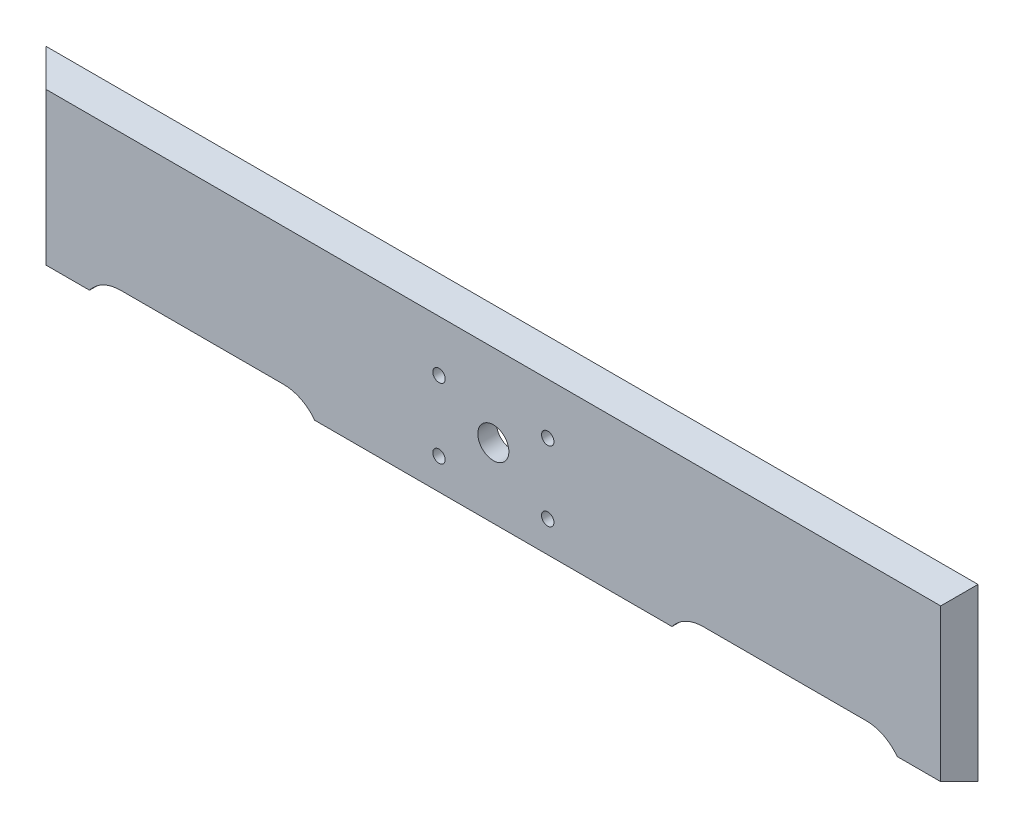
ISO-10303-21;
HEADER;
FILE_DESCRIPTION(('STEP AP214'),'2;1');
FILE_NAME('part.step','',(''),(''),'','','');
FILE_SCHEMA(('AUTOMOTIVE_DESIGN { 1 0 10303 214 1 1 1 1 }'));
ENDSEC;
DATA;
#1=APPLICATION_CONTEXT('core data for automotive mechanical design processes');
#2=APPLICATION_PROTOCOL_DEFINITION('international standard','automotive_design',2000,#1);
#3=PRODUCT_CONTEXT('',#1,'mechanical');
#4=PRODUCT('Part','Part','',(#3));
#5=PRODUCT_RELATED_PRODUCT_CATEGORY('part','',(#4));
#6=PRODUCT_DEFINITION_FORMATION('','',#4);
#7=PRODUCT_DEFINITION_CONTEXT('part definition',#1,'design');
#8=PRODUCT_DEFINITION('design','',#6,#7);
#9=PRODUCT_DEFINITION_SHAPE('','',#8);
#10=(LENGTH_UNIT() NAMED_UNIT(*) SI_UNIT(.MILLI.,.METRE.));
#11=(NAMED_UNIT(*) PLANE_ANGLE_UNIT() SI_UNIT($,.RADIAN.));
#12=(NAMED_UNIT(*) SI_UNIT($,.STERADIAN.) SOLID_ANGLE_UNIT());
#13=UNCERTAINTY_MEASURE_WITH_UNIT(LENGTH_MEASURE(1.E-05),#10,'distance_accuracy_value','');
#14=(GEOMETRIC_REPRESENTATION_CONTEXT(3) GLOBAL_UNCERTAINTY_ASSIGNED_CONTEXT((#13)) GLOBAL_UNIT_ASSIGNED_CONTEXT((#10,
#11,#12)) REPRESENTATION_CONTEXT('',''));
#15=CARTESIAN_POINT('',(0.,0.,0.));
#16=DIRECTION('',(0.,0.,1.));
#17=DIRECTION('',(1.,0.,0.));
#18=AXIS2_PLACEMENT_3D('',#15,#16,#17);
#19=CARTESIAN_POINT('',(0.,-10.,12.));
#20=DIRECTION('',(0.,1.,0.));
#21=DIRECTION('',(-1.,0.,0.));
#22=AXIS2_PLACEMENT_3D('',#19,#20,#21);
#23=PLANE('',#22);
#24=DIRECTION('',(1.,0.,0.));
#25=VECTOR('',#24,1.);
#26=CARTESIAN_POINT('',(0.,-10.,12.));
#27=LINE('',#26,#25);
#28=CARTESIAN_POINT('',(12.,-10.,12.));
#29=VERTEX_POINT('',#28);
#30=CARTESIAN_POINT('',(40.,-10.,12.));
#31=VERTEX_POINT('',#30);
#32=EDGE_CURVE('E133',#29,#31,#27,.T.);
#33=ORIENTED_EDGE('',*,*,#32,.F.);
#34=DIRECTION('',(-0.707106781186547,0.,-0.707106781186548));
#35=VECTOR('',#34,1.);
#36=CARTESIAN_POINT('',(12.,-10.,12.));
#37=LINE('',#36,#35);
#38=CARTESIAN_POINT('',(0.,-10.,0.));
#39=VERTEX_POINT('',#38);
#40=EDGE_CURVE('E11',#29,#39,#37,.T.);
#41=ORIENTED_EDGE('',*,*,#40,.T.);
#42=DIRECTION('',(1.,0.,0.));
#43=VECTOR('',#42,1.);
#44=CARTESIAN_POINT('',(0.,-10.,0.));
#45=LINE('',#44,#43);
#46=CARTESIAN_POINT('',(40.,-10.,0.));
#47=VERTEX_POINT('',#46);
#48=EDGE_CURVE('E149',#39,#47,#45,.T.);
#49=ORIENTED_EDGE('',*,*,#48,.T.);
#50=DIRECTION('',(0.,0.,-1.));
#51=VECTOR('',#50,1.);
#52=CARTESIAN_POINT('',(40.,-10.,12.));
#53=LINE('',#52,#51);
#54=EDGE_CURVE('E147',#31,#47,#53,.T.);
#55=ORIENTED_EDGE('',*,*,#54,.F.);
#56=EDGE_LOOP('',(#33,#41,#49,#55));
#57=FACE_BOUND('',#56,.T.);
#58=ADVANCED_FACE('F41',(#57),#23,.F.);
#59=CARTESIAN_POINT('',(60.,-25.,12.));
#60=DIRECTION('',(0.,0.,-1.));
#61=DIRECTION('',(-1.,0.,0.));
#62=AXIS2_PLACEMENT_3D('',#59,#60,#61);
#63=CYLINDRICAL_SURFACE('',#62,25.);
#64=CARTESIAN_POINT('',(60.,-25.,0.));
#65=DIRECTION('',(0.,0.,-1.));
#66=DIRECTION('',(-1.,0.,0.));
#67=AXIS2_PLACEMENT_3D('',#64,#65,#66);
#68=CIRCLE('',#67,25.);
#69=CARTESIAN_POINT('',(60.,0.,0.));
#70=VERTEX_POINT('',#69);
#71=EDGE_CURVE('E190',#47,#70,#68,.T.);
#72=ORIENTED_EDGE('',*,*,#71,.T.);
#73=DIRECTION('',(0.,0.,-1.));
#74=VECTOR('',#73,1.);
#75=CARTESIAN_POINT('',(60.,0.,12.));
#76=LINE('',#75,#74);
#77=CARTESIAN_POINT('',(60.,0.,12.));
#78=VERTEX_POINT('',#77);
#79=EDGE_CURVE('E153',#78,#70,#76,.T.);
#80=ORIENTED_EDGE('',*,*,#79,.F.);
#81=CARTESIAN_POINT('',(60.,-25.,12.));
#82=DIRECTION('',(0.,0.,-1.));
#83=DIRECTION('',(-1.,0.,0.));
#84=AXIS2_PLACEMENT_3D('',#81,#82,#83);
#85=CIRCLE('',#84,25.);
#86=EDGE_CURVE('E138',#31,#78,#85,.T.);
#87=ORIENTED_EDGE('',*,*,#86,.F.);
#88=ORIENTED_EDGE('',*,*,#54,.T.);
#89=EDGE_LOOP('',(#72,#80,#87,#88));
#90=FACE_BOUND('',#89,.T.);
#91=ADVANCED_FACE('F155',(#90),#63,.F.);
#92=CARTESIAN_POINT('',(60.,0.,12.));
#93=DIRECTION('',(0.,1.,0.));
#94=DIRECTION('',(0.,0.,1.));
#95=AXIS2_PLACEMENT_3D('',#92,#93,#94);
#96=PLANE('',#95);
#97=DIRECTION('',(1.,0.,0.));
#98=VECTOR('',#97,1.);
#99=CARTESIAN_POINT('',(60.,0.,0.));
#100=LINE('',#99,#98);
#101=CARTESIAN_POINT('',(165.,0.,0.));
#102=VERTEX_POINT('',#101);
#103=EDGE_CURVE('E193',#70,#102,#100,.T.);
#104=ORIENTED_EDGE('',*,*,#103,.T.);
#105=DIRECTION('',(0.,0.,-1.));
#106=VECTOR('',#105,1.);
#107=CARTESIAN_POINT('',(165.,0.,12.));
#108=LINE('',#107,#106);
#109=CARTESIAN_POINT('',(165.,0.,12.));
#110=VERTEX_POINT('',#109);
#111=EDGE_CURVE('E240',#110,#102,#108,.T.);
#112=ORIENTED_EDGE('',*,*,#111,.F.);
#113=DIRECTION('',(1.,0.,0.));
#114=VECTOR('',#113,1.);
#115=CARTESIAN_POINT('',(60.,0.,12.));
#116=LINE('',#115,#114);
#117=EDGE_CURVE('E159',#78,#110,#116,.T.);
#118=ORIENTED_EDGE('',*,*,#117,.F.);
#119=ORIENTED_EDGE('',*,*,#79,.T.);
#120=EDGE_LOOP('',(#104,#112,#118,#119));
#121=FACE_BOUND('',#120,.T.);
#122=ADVANCED_FACE('F347',(#121),#96,.F.);
#123=CARTESIAN_POINT('',(165.,-25.,12.));
#124=DIRECTION('',(0.,0.,-1.));
#125=DIRECTION('',(-1.,0.,0.));
#126=AXIS2_PLACEMENT_3D('',#123,#124,#125);
#127=CYLINDRICAL_SURFACE('',#126,25.);
#128=CARTESIAN_POINT('',(165.,-25.,0.));
#129=DIRECTION('',(0.,0.,-1.));
#130=DIRECTION('',(1.,0.,0.));
#131=AXIS2_PLACEMENT_3D('',#128,#129,#130);
#132=CIRCLE('',#131,25.);
#133=CARTESIAN_POINT('',(185.,-10.0000000000001,0.));
#134=VERTEX_POINT('',#133);
#135=EDGE_CURVE('E196',#102,#134,#132,.T.);
#136=ORIENTED_EDGE('',*,*,#135,.T.);
#137=DIRECTION('',(0.,0.,-1.));
#138=VECTOR('',#137,1.);
#139=CARTESIAN_POINT('',(185.,-10.0000000000001,12.));
#140=LINE('',#139,#138);
#141=CARTESIAN_POINT('',(185.,-10.0000000000001,12.));
#142=VERTEX_POINT('',#141);
#143=EDGE_CURVE('E236',#142,#134,#140,.T.);
#144=ORIENTED_EDGE('',*,*,#143,.F.);
#145=CARTESIAN_POINT('',(165.,-25.,12.));
#146=DIRECTION('',(0.,0.,-1.));
#147=DIRECTION('',(1.,0.,0.));
#148=AXIS2_PLACEMENT_3D('',#145,#146,#147);
#149=CIRCLE('',#148,25.);
#150=EDGE_CURVE('E162',#110,#142,#149,.T.);
#151=ORIENTED_EDGE('',*,*,#150,.F.);
#152=ORIENTED_EDGE('',*,*,#111,.T.);
#153=EDGE_LOOP('',(#136,#144,#151,#152));
#154=FACE_BOUND('',#153,.T.);
#155=ADVANCED_FACE('F344',(#154),#127,.F.);
#156=CARTESIAN_POINT('',(185.,-10.,12.));
#157=DIRECTION('',(0.,1.,0.));
#158=DIRECTION('',(0.,0.,1.));
#159=AXIS2_PLACEMENT_3D('',#156,#157,#158);
#160=PLANE('',#159);
#161=DIRECTION('',(1.,0.,0.));
#162=VECTOR('',#161,1.);
#163=CARTESIAN_POINT('',(185.,-10.,0.));
#164=LINE('',#163,#162);
#165=CARTESIAN_POINT('',(415.,-10.,0.));
#166=VERTEX_POINT('',#165);
#167=EDGE_CURVE('E199',#134,#166,#164,.T.);
#168=ORIENTED_EDGE('',*,*,#167,.T.);
#169=DIRECTION('',(0.,0.,-1.));
#170=VECTOR('',#169,1.);
#171=CARTESIAN_POINT('',(415.,-10.,12.));
#172=LINE('',#171,#170);
#173=CARTESIAN_POINT('',(415.,-10.,12.));
#174=VERTEX_POINT('',#173);
#175=EDGE_CURVE('E232',#174,#166,#172,.T.);
#176=ORIENTED_EDGE('',*,*,#175,.F.);
#177=DIRECTION('',(1.,0.,0.));
#178=VECTOR('',#177,1.);
#179=CARTESIAN_POINT('',(185.,-10.,12.));
#180=LINE('',#179,#178);
#181=EDGE_CURVE('E168',#142,#174,#180,.T.);
#182=ORIENTED_EDGE('',*,*,#181,.F.);
#183=ORIENTED_EDGE('',*,*,#143,.T.);
#184=EDGE_LOOP('',(#168,#176,#182,#183));
#185=FACE_BOUND('',#184,.T.);
#186=ADVANCED_FACE('F339',(#185),#160,.F.);
#187=CARTESIAN_POINT('',(435.,-25.,12.));
#188=DIRECTION('',(0.,0.,-1.));
#189=DIRECTION('',(-1.,0.,0.));
#190=AXIS2_PLACEMENT_3D('',#187,#188,#189);
#191=CYLINDRICAL_SURFACE('',#190,25.);
#192=CARTESIAN_POINT('',(435.,-25.,0.));
#193=DIRECTION('',(0.,0.,-1.));
#194=DIRECTION('',(-1.,0.,0.));
#195=AXIS2_PLACEMENT_3D('',#192,#193,#194);
#196=CIRCLE('',#195,25.);
#197=CARTESIAN_POINT('',(435.,0.,0.));
#198=VERTEX_POINT('',#197);
#199=EDGE_CURVE('E202',#166,#198,#196,.T.);
#200=ORIENTED_EDGE('',*,*,#199,.T.);
#201=DIRECTION('',(0.,0.,-1.));
#202=VECTOR('',#201,1.);
#203=CARTESIAN_POINT('',(435.,0.,12.));
#204=LINE('',#203,#202);
#205=CARTESIAN_POINT('',(435.,0.,12.));
#206=VERTEX_POINT('',#205);
#207=EDGE_CURVE('E228',#206,#198,#204,.T.);
#208=ORIENTED_EDGE('',*,*,#207,.F.);
#209=CARTESIAN_POINT('',(435.,-25.,12.));
#210=DIRECTION('',(0.,0.,-1.));
#211=DIRECTION('',(-1.,0.,0.));
#212=AXIS2_PLACEMENT_3D('',#209,#210,#211);
#213=CIRCLE('',#212,25.);
#214=EDGE_CURVE('E171',#174,#206,#213,.T.);
#215=ORIENTED_EDGE('',*,*,#214,.F.);
#216=ORIENTED_EDGE('',*,*,#175,.T.);
#217=EDGE_LOOP('',(#200,#208,#215,#216));
#218=FACE_BOUND('',#217,.T.);
#219=ADVANCED_FACE('F333',(#218),#191,.F.);
#220=CARTESIAN_POINT('',(435.,0.,12.));
#221=DIRECTION('',(0.,1.,0.));
#222=DIRECTION('',(0.,0.,1.));
#223=AXIS2_PLACEMENT_3D('',#220,#221,#222);
#224=PLANE('',#223);
#225=DIRECTION('',(1.,0.,0.));
#226=VECTOR('',#225,1.);
#227=CARTESIAN_POINT('',(435.,0.,0.));
#228=LINE('',#227,#226);
#229=CARTESIAN_POINT('',(540.,0.,0.));
#230=VERTEX_POINT('',#229);
#231=EDGE_CURVE('E205',#198,#230,#228,.T.);
#232=ORIENTED_EDGE('',*,*,#231,.T.);
#233=DIRECTION('',(0.,0.,-1.));
#234=VECTOR('',#233,1.);
#235=CARTESIAN_POINT('',(540.,0.,12.));
#236=LINE('',#235,#234);
#237=CARTESIAN_POINT('',(540.,0.,12.));
#238=VERTEX_POINT('',#237);
#239=EDGE_CURVE('E224',#238,#230,#236,.T.);
#240=ORIENTED_EDGE('',*,*,#239,.F.);
#241=DIRECTION('',(1.,0.,0.));
#242=VECTOR('',#241,1.);
#243=CARTESIAN_POINT('',(435.,0.,12.));
#244=LINE('',#243,#242);
#245=EDGE_CURVE('E174',#206,#238,#244,.T.);
#246=ORIENTED_EDGE('',*,*,#245,.F.);
#247=ORIENTED_EDGE('',*,*,#207,.T.);
#248=EDGE_LOOP('',(#232,#240,#246,#247));
#249=FACE_BOUND('',#248,.T.);
#250=ADVANCED_FACE('F329',(#249),#224,.F.);
#251=CARTESIAN_POINT('',(540.,-25.,12.));
#252=DIRECTION('',(0.,0.,-1.));
#253=DIRECTION('',(-1.,0.,0.));
#254=AXIS2_PLACEMENT_3D('',#251,#252,#253);
#255=CYLINDRICAL_SURFACE('',#254,25.);
#256=CARTESIAN_POINT('',(540.,-25.,0.));
#257=DIRECTION('',(0.,0.,-1.));
#258=DIRECTION('',(1.,0.,0.));
#259=AXIS2_PLACEMENT_3D('',#256,#257,#258);
#260=CIRCLE('',#259,25.);
#261=CARTESIAN_POINT('',(560.,-10.,0.));
#262=VERTEX_POINT('',#261);
#263=EDGE_CURVE('E208',#230,#262,#260,.T.);
#264=ORIENTED_EDGE('',*,*,#263,.T.);
#265=DIRECTION('',(0.,0.,-1.));
#266=VECTOR('',#265,1.);
#267=CARTESIAN_POINT('',(560.,-10.,12.));
#268=LINE('',#267,#266);
#269=CARTESIAN_POINT('',(560.,-10.,12.));
#270=VERTEX_POINT('',#269);
#271=EDGE_CURVE('E183',#270,#262,#268,.T.);
#272=ORIENTED_EDGE('',*,*,#271,.F.);
#273=CARTESIAN_POINT('',(540.,-25.,12.));
#274=DIRECTION('',(0.,0.,-1.));
#275=DIRECTION('',(1.,0.,0.));
#276=AXIS2_PLACEMENT_3D('',#273,#274,#275);
#277=CIRCLE('',#276,25.);
#278=EDGE_CURVE('E177',#238,#270,#277,.T.);
#279=ORIENTED_EDGE('',*,*,#278,.F.);
#280=ORIENTED_EDGE('',*,*,#239,.T.);
#281=EDGE_LOOP('',(#264,#272,#279,#280));
#282=FACE_BOUND('',#281,.T.);
#283=ADVANCED_FACE('F324',(#282),#255,.F.);
#284=CARTESIAN_POINT('',(600.,-10.,12.));
#285=DIRECTION('',(0.,1.,0.));
#286=DIRECTION('',(-1.,0.,0.));
#287=AXIS2_PLACEMENT_3D('',#284,#285,#286);
#288=PLANE('',#287);
#289=DIRECTION('',(1.,0.,0.));
#290=VECTOR('',#289,1.);
#291=CARTESIAN_POINT('',(600.,-10.,0.));
#292=LINE('',#291,#290);
#293=CARTESIAN_POINT('',(600.,-10.,0.));
#294=VERTEX_POINT('',#293);
#295=EDGE_CURVE('E211',#262,#294,#292,.T.);
#296=ORIENTED_EDGE('',*,*,#295,.T.);
#297=DIRECTION('',(-0.707106781186548,0.,0.707106781186548));
#298=VECTOR('',#297,1.);
#299=CARTESIAN_POINT('',(588.,-10.,12.));
#300=LINE('',#299,#298);
#301=CARTESIAN_POINT('',(588.,-10.,12.));
#302=VERTEX_POINT('',#301);
#303=EDGE_CURVE('E52',#294,#302,#300,.T.);
#304=ORIENTED_EDGE('',*,*,#303,.T.);
#305=DIRECTION('',(1.,0.,0.));
#306=VECTOR('',#305,1.);
#307=CARTESIAN_POINT('',(600.,-10.,12.));
#308=LINE('',#307,#306);
#309=EDGE_CURVE('E180',#270,#302,#308,.T.);
#310=ORIENTED_EDGE('',*,*,#309,.F.);
#311=ORIENTED_EDGE('',*,*,#271,.T.);
#312=EDGE_LOOP('',(#296,#304,#310,#311));
#313=FACE_BOUND('',#312,.T.);
#314=ADVANCED_FACE('F317',(#313),#288,.F.);
#315=CARTESIAN_POINT('',(540.,-25.,12.));
#316=DIRECTION('',(0.,0.,1.));
#317=DIRECTION('',(1.,0.,0.));
#318=AXIS2_PLACEMENT_3D('',#315,#316,#317);
#319=PLANE('',#318);
#320=CARTESIAN_POINT('',(265.,9.99999999999995,12.));
#321=DIRECTION('',(0.,0.,-1.));
#322=DIRECTION('',(-1.,0.,0.));
#323=AXIS2_PLACEMENT_3D('',#320,#321,#322);
#324=CIRCLE('',#323,3.99999999999999);
#325=CARTESIAN_POINT('',(261.,9.99999999999995,12.));
#326=VERTEX_POINT('',#325);
#327=EDGE_CURVE('E268',#326,#326,#324,.T.);
#328=ORIENTED_EDGE('',*,*,#327,.T.);
#329=EDGE_LOOP('',(#328));
#330=FACE_BOUND('',#329,.T.);
#331=CARTESIAN_POINT('',(335.,9.99999999999995,12.));
#332=DIRECTION('',(0.,0.,-1.));
#333=DIRECTION('',(-1.,0.,0.));
#334=AXIS2_PLACEMENT_3D('',#331,#332,#333);
#335=CIRCLE('',#334,3.99999999999999);
#336=CARTESIAN_POINT('',(331.,9.99999999999995,12.));
#337=VERTEX_POINT('',#336);
#338=EDGE_CURVE('E276',#337,#337,#335,.T.);
#339=ORIENTED_EDGE('',*,*,#338,.T.);
#340=EDGE_LOOP('',(#339));
#341=FACE_BOUND('',#340,.T.);
#342=CARTESIAN_POINT('',(265.,55.,12.));
#343=DIRECTION('',(0.,0.,-1.));
#344=DIRECTION('',(-1.,0.,0.));
#345=AXIS2_PLACEMENT_3D('',#342,#343,#344);
#346=CIRCLE('',#345,3.99999999999999);
#347=CARTESIAN_POINT('',(261.,55.,12.));
#348=VERTEX_POINT('',#347);
#349=EDGE_CURVE('E284',#348,#348,#346,.T.);
#350=ORIENTED_EDGE('',*,*,#349,.T.);
#351=EDGE_LOOP('',(#350));
#352=FACE_BOUND('',#351,.T.);
#353=CARTESIAN_POINT('',(300.,35.,12.));
#354=DIRECTION('',(0.,0.,-1.));
#355=DIRECTION('',(-1.,0.,0.));
#356=AXIS2_PLACEMENT_3D('',#353,#354,#355);
#357=CIRCLE('',#356,9.99999999999998);
#358=CARTESIAN_POINT('',(290.,35.,12.));
#359=VERTEX_POINT('',#358);
#360=EDGE_CURVE('E292',#359,#359,#357,.T.);
#361=ORIENTED_EDGE('',*,*,#360,.T.);
#362=EDGE_LOOP('',(#361));
#363=FACE_BOUND('',#362,.T.);
#364=CARTESIAN_POINT('',(335.,55.,12.));
#365=DIRECTION('',(0.,0.,-1.));
#366=DIRECTION('',(-1.,0.,0.));
#367=AXIS2_PLACEMENT_3D('',#364,#365,#366);
#368=CIRCLE('',#367,3.99999999999999);
#369=CARTESIAN_POINT('',(331.,55.,12.));
#370=VERTEX_POINT('',#369);
#371=EDGE_CURVE('E255',#370,#370,#368,.T.);
#372=ORIENTED_EDGE('',*,*,#371,.T.);
#373=EDGE_LOOP('',(#372));
#374=FACE_BOUND('',#373,.T.);
#375=ORIENTED_EDGE('',*,*,#309,.T.);
#376=DIRECTION('',(0.,1.,0.));
#377=VECTOR('',#376,1.);
#378=CARTESIAN_POINT('',(588.,100.,12.));
#379=LINE('',#378,#377);
#380=CARTESIAN_POINT('',(588.,88.,12.));
#381=VERTEX_POINT('',#380);
#382=EDGE_CURVE('E250',#302,#381,#379,.T.);
#383=ORIENTED_EDGE('',*,*,#382,.T.);
#384=DIRECTION('',(-1.,0.,0.));
#385=VECTOR('',#384,1.);
#386=CARTESIAN_POINT('',(0.,88.,12.));
#387=LINE('',#386,#385);
#388=CARTESIAN_POINT('',(12.,88.,12.));
#389=VERTEX_POINT('',#388);
#390=EDGE_CURVE('E60',#381,#389,#387,.T.);
#391=ORIENTED_EDGE('',*,*,#390,.T.);
#392=DIRECTION('',(0.,-1.,0.));
#393=VECTOR('',#392,1.);
#394=CARTESIAN_POINT('',(12.,-10.,12.));
#395=LINE('',#394,#393);
#396=EDGE_CURVE('E140',#389,#29,#395,.T.);
#397=ORIENTED_EDGE('',*,*,#396,.T.);
#398=ORIENTED_EDGE('',*,*,#32,.T.);
#399=ORIENTED_EDGE('',*,*,#86,.T.);
#400=ORIENTED_EDGE('',*,*,#117,.T.);
#401=ORIENTED_EDGE('',*,*,#150,.T.);
#402=ORIENTED_EDGE('',*,*,#181,.T.);
#403=ORIENTED_EDGE('',*,*,#214,.T.);
#404=ORIENTED_EDGE('',*,*,#245,.T.);
#405=ORIENTED_EDGE('',*,*,#278,.T.);
#406=EDGE_LOOP('',(#375,#383,#391,#397,#398,#399,#400,#401,#402,#403,#404,#405));
#407=FACE_BOUND('',#406,.T.);
#408=ADVANCED_FACE('F136',(#330,#341,#352,#363,#374,#407),#319,.T.);
#409=CARTESIAN_POINT('',(540.,-25.,0.));
#410=DIRECTION('',(0.,0.,1.));
#411=DIRECTION('',(1.,0.,0.));
#412=AXIS2_PLACEMENT_3D('',#409,#410,#411);
#413=PLANE('',#412);
#414=CARTESIAN_POINT('',(265.,9.99999999999995,0.));
#415=DIRECTION('',(0.,0.,-1.));
#416=DIRECTION('',(-1.,0.,0.));
#417=AXIS2_PLACEMENT_3D('',#414,#415,#416);
#418=CIRCLE('',#417,3.99999999999999);
#419=CARTESIAN_POINT('',(261.,9.99999999999995,0.));
#420=VERTEX_POINT('',#419);
#421=EDGE_CURVE('E272',#420,#420,#418,.T.);
#422=ORIENTED_EDGE('',*,*,#421,.F.);
#423=EDGE_LOOP('',(#422));
#424=FACE_BOUND('',#423,.T.);
#425=CARTESIAN_POINT('',(335.,9.99999999999995,0.));
#426=DIRECTION('',(0.,0.,-1.));
#427=DIRECTION('',(-1.,0.,0.));
#428=AXIS2_PLACEMENT_3D('',#425,#426,#427);
#429=CIRCLE('',#428,3.99999999999999);
#430=CARTESIAN_POINT('',(331.,9.99999999999995,0.));
#431=VERTEX_POINT('',#430);
#432=EDGE_CURVE('E280',#431,#431,#429,.T.);
#433=ORIENTED_EDGE('',*,*,#432,.F.);
#434=EDGE_LOOP('',(#433));
#435=FACE_BOUND('',#434,.T.);
#436=CARTESIAN_POINT('',(265.,55.,0.));
#437=DIRECTION('',(0.,0.,-1.));
#438=DIRECTION('',(-1.,0.,0.));
#439=AXIS2_PLACEMENT_3D('',#436,#437,#438);
#440=CIRCLE('',#439,3.99999999999999);
#441=CARTESIAN_POINT('',(261.,55.,0.));
#442=VERTEX_POINT('',#441);
#443=EDGE_CURVE('E288',#442,#442,#440,.T.);
#444=ORIENTED_EDGE('',*,*,#443,.F.);
#445=EDGE_LOOP('',(#444));
#446=FACE_BOUND('',#445,.T.);
#447=CARTESIAN_POINT('',(300.,35.,0.));
#448=DIRECTION('',(0.,0.,-1.));
#449=DIRECTION('',(-1.,0.,0.));
#450=AXIS2_PLACEMENT_3D('',#447,#448,#449);
#451=CIRCLE('',#450,9.99999999999998);
#452=CARTESIAN_POINT('',(290.,35.,0.));
#453=VERTEX_POINT('',#452);
#454=EDGE_CURVE('E266',#453,#453,#451,.T.);
#455=ORIENTED_EDGE('',*,*,#454,.F.);
#456=EDGE_LOOP('',(#455));
#457=FACE_BOUND('',#456,.T.);
#458=CARTESIAN_POINT('',(335.,55.,0.));
#459=DIRECTION('',(0.,0.,-1.));
#460=DIRECTION('',(-1.,0.,0.));
#461=AXIS2_PLACEMENT_3D('',#458,#459,#460);
#462=CIRCLE('',#461,3.99999999999999);
#463=CARTESIAN_POINT('',(331.,55.,0.));
#464=VERTEX_POINT('',#463);
#465=EDGE_CURVE('E260',#464,#464,#462,.T.);
#466=ORIENTED_EDGE('',*,*,#465,.F.);
#467=EDGE_LOOP('',(#466));
#468=FACE_BOUND('',#467,.T.);
#469=DIRECTION('',(0.,-1.,0.));
#470=VECTOR('',#469,1.);
#471=CARTESIAN_POINT('',(0.,0.,0.));
#472=LINE('',#471,#470);
#473=CARTESIAN_POINT('',(0.,100.,0.));
#474=VERTEX_POINT('',#473);
#475=EDGE_CURVE('E184',#474,#39,#472,.T.);
#476=ORIENTED_EDGE('',*,*,#475,.F.);
#477=DIRECTION('',(-1.,0.,0.));
#478=VECTOR('',#477,1.);
#479=CARTESIAN_POINT('',(0.,100.,0.));
#480=LINE('',#479,#478);
#481=CARTESIAN_POINT('',(600.,100.,0.));
#482=VERTEX_POINT('',#481);
#483=EDGE_CURVE('E144',#482,#474,#480,.T.);
#484=ORIENTED_EDGE('',*,*,#483,.F.);
#485=DIRECTION('',(0.,1.,0.));
#486=VECTOR('',#485,1.);
#487=CARTESIAN_POINT('',(600.,0.,0.));
#488=LINE('',#487,#486);
#489=EDGE_CURVE('E215',#294,#482,#488,.T.);
#490=ORIENTED_EDGE('',*,*,#489,.F.);
#491=ORIENTED_EDGE('',*,*,#295,.F.);
#492=ORIENTED_EDGE('',*,*,#263,.F.);
#493=ORIENTED_EDGE('',*,*,#231,.F.);
#494=ORIENTED_EDGE('',*,*,#199,.F.);
#495=ORIENTED_EDGE('',*,*,#167,.F.);
#496=ORIENTED_EDGE('',*,*,#135,.F.);
#497=ORIENTED_EDGE('',*,*,#103,.F.);
#498=ORIENTED_EDGE('',*,*,#71,.F.);
#499=ORIENTED_EDGE('',*,*,#48,.F.);
#500=EDGE_LOOP('',(#476,#484,#490,#491,#492,#493,#494,#495,#496,#497,#498,#499));
#501=FACE_BOUND('',#500,.T.);
#502=ADVANCED_FACE('F302',(#424,#435,#446,#457,#468,#501),#413,.F.);
#503=CARTESIAN_POINT('',(12.,-25.0000000000001,12.));
#504=DIRECTION('',(-0.707106781186548,0.,0.707106781186547));
#505=DIRECTION('',(0.,1.,0.));
#506=AXIS2_PLACEMENT_3D('',#503,#504,#505);
#507=PLANE('',#506);
#508=ORIENTED_EDGE('',*,*,#40,.F.);
#509=ORIENTED_EDGE('',*,*,#396,.F.);
#510=DIRECTION('',(0.577350269189626,-0.577350269189626,0.577350269189626));
#511=VECTOR('',#510,1.);
#512=CARTESIAN_POINT('',(188.,-88.,188.));
#513=LINE('',#512,#511);
#514=EDGE_CURVE('E46',#474,#389,#513,.T.);
#515=ORIENTED_EDGE('',*,*,#514,.F.);
#516=ORIENTED_EDGE('',*,*,#475,.T.);
#517=EDGE_LOOP('',(#508,#509,#515,#516));
#518=FACE_BOUND('',#517,.T.);
#519=ADVANCED_FACE('F44',(#518),#507,.T.);
#520=CARTESIAN_POINT('',(540.,88.,12.));
#521=DIRECTION('',(0.,0.707106781186547,0.707106781186547));
#522=DIRECTION('',(1.,0.,0.));
#523=AXIS2_PLACEMENT_3D('',#520,#521,#522);
#524=PLANE('',#523);
#525=ORIENTED_EDGE('',*,*,#514,.T.);
#526=ORIENTED_EDGE('',*,*,#390,.F.);
#527=DIRECTION('',(0.577350269189626,0.577350269189626,-0.577350269189626));
#528=VECTOR('',#527,1.);
#529=CARTESIAN_POINT('',(572.,72.,28.));
#530=LINE('',#529,#528);
#531=EDGE_CURVE('E68',#482,#381,#530,.F.);
#532=ORIENTED_EDGE('',*,*,#531,.F.);
#533=ORIENTED_EDGE('',*,*,#483,.T.);
#534=EDGE_LOOP('',(#525,#526,#532,#533));
#535=FACE_BOUND('',#534,.T.);
#536=ADVANCED_FACE('F312',(#535),#524,.T.);
#537=CARTESIAN_POINT('',(588.,-25.,12.));
#538=DIRECTION('',(0.707106781186547,0.,0.707106781186547));
#539=DIRECTION('',(0.,-1.,0.));
#540=AXIS2_PLACEMENT_3D('',#537,#538,#539);
#541=PLANE('',#540);
#542=ORIENTED_EDGE('',*,*,#303,.F.);
#543=ORIENTED_EDGE('',*,*,#489,.T.);
#544=ORIENTED_EDGE('',*,*,#531,.T.);
#545=ORIENTED_EDGE('',*,*,#382,.F.);
#546=EDGE_LOOP('',(#542,#543,#544,#545));
#547=FACE_BOUND('',#546,.T.);
#548=ADVANCED_FACE('F315',(#547),#541,.T.);
#549=CARTESIAN_POINT('',(335.,55.,12.));
#550=DIRECTION('',(0.,0.,-1.));
#551=DIRECTION('',(-1.,0.,0.));
#552=AXIS2_PLACEMENT_3D('',#549,#550,#551);
#553=CYLINDRICAL_SURFACE('',#552,3.99999999999999);
#554=ORIENTED_EDGE('',*,*,#371,.F.);
#555=EDGE_LOOP('',(#554));
#556=FACE_BOUND('',#555,.T.);
#557=ORIENTED_EDGE('',*,*,#465,.T.);
#558=EDGE_LOOP('',(#557));
#559=FACE_BOUND('',#558,.T.);
#560=ADVANCED_FACE('F366',(#556,#559),#553,.F.);
#561=CARTESIAN_POINT('',(300.,35.,12.));
#562=DIRECTION('',(0.,0.,-1.));
#563=DIRECTION('',(-1.,0.,0.));
#564=AXIS2_PLACEMENT_3D('',#561,#562,#563);
#565=CYLINDRICAL_SURFACE('',#564,9.99999999999998);
#566=ORIENTED_EDGE('',*,*,#360,.F.);
#567=EDGE_LOOP('',(#566));
#568=FACE_BOUND('',#567,.T.);
#569=ORIENTED_EDGE('',*,*,#454,.T.);
#570=EDGE_LOOP('',(#569));
#571=FACE_BOUND('',#570,.T.);
#572=ADVANCED_FACE('F300',(#568,#571),#565,.F.);
#573=CARTESIAN_POINT('',(265.,55.,12.));
#574=DIRECTION('',(0.,0.,-1.));
#575=DIRECTION('',(-1.,0.,0.));
#576=AXIS2_PLACEMENT_3D('',#573,#574,#575);
#577=CYLINDRICAL_SURFACE('',#576,3.99999999999999);
#578=ORIENTED_EDGE('',*,*,#349,.F.);
#579=EDGE_LOOP('',(#578));
#580=FACE_BOUND('',#579,.T.);
#581=ORIENTED_EDGE('',*,*,#443,.T.);
#582=EDGE_LOOP('',(#581));
#583=FACE_BOUND('',#582,.T.);
#584=ADVANCED_FACE('F477',(#580,#583),#577,.F.);
#585=CARTESIAN_POINT('',(335.,9.99999999999995,12.));
#586=DIRECTION('',(0.,0.,-1.));
#587=DIRECTION('',(-1.,0.,0.));
#588=AXIS2_PLACEMENT_3D('',#585,#586,#587);
#589=CYLINDRICAL_SURFACE('',#588,3.99999999999999);
#590=ORIENTED_EDGE('',*,*,#338,.F.);
#591=EDGE_LOOP('',(#590));
#592=FACE_BOUND('',#591,.T.);
#593=ORIENTED_EDGE('',*,*,#432,.T.);
#594=EDGE_LOOP('',(#593));
#595=FACE_BOUND('',#594,.T.);
#596=ADVANCED_FACE('F486',(#592,#595),#589,.F.);
#597=CARTESIAN_POINT('',(265.,9.99999999999995,12.));
#598=DIRECTION('',(0.,0.,-1.));
#599=DIRECTION('',(-1.,0.,0.));
#600=AXIS2_PLACEMENT_3D('',#597,#598,#599);
#601=CYLINDRICAL_SURFACE('',#600,3.99999999999999);
#602=ORIENTED_EDGE('',*,*,#327,.F.);
#603=EDGE_LOOP('',(#602));
#604=FACE_BOUND('',#603,.T.);
#605=ORIENTED_EDGE('',*,*,#421,.T.);
#606=EDGE_LOOP('',(#605));
#607=FACE_BOUND('',#606,.T.);
#608=ADVANCED_FACE('F495',(#604,#607),#601,.F.);
#609=CLOSED_SHELL('',(#58,#91,#122,#155,#186,#219,#250,#283,#314,#408,#502,#519,#536,#548,#560,
#572,#584,#596,#608));
#610=MANIFOLD_SOLID_BREP('B2',#609);
#611=ADVANCED_BREP_SHAPE_REPRESENTATION('',(#18,#610),#14);
#612=SHAPE_DEFINITION_REPRESENTATION(#9,#611);
ENDSEC;
END-ISO-10303-21;
